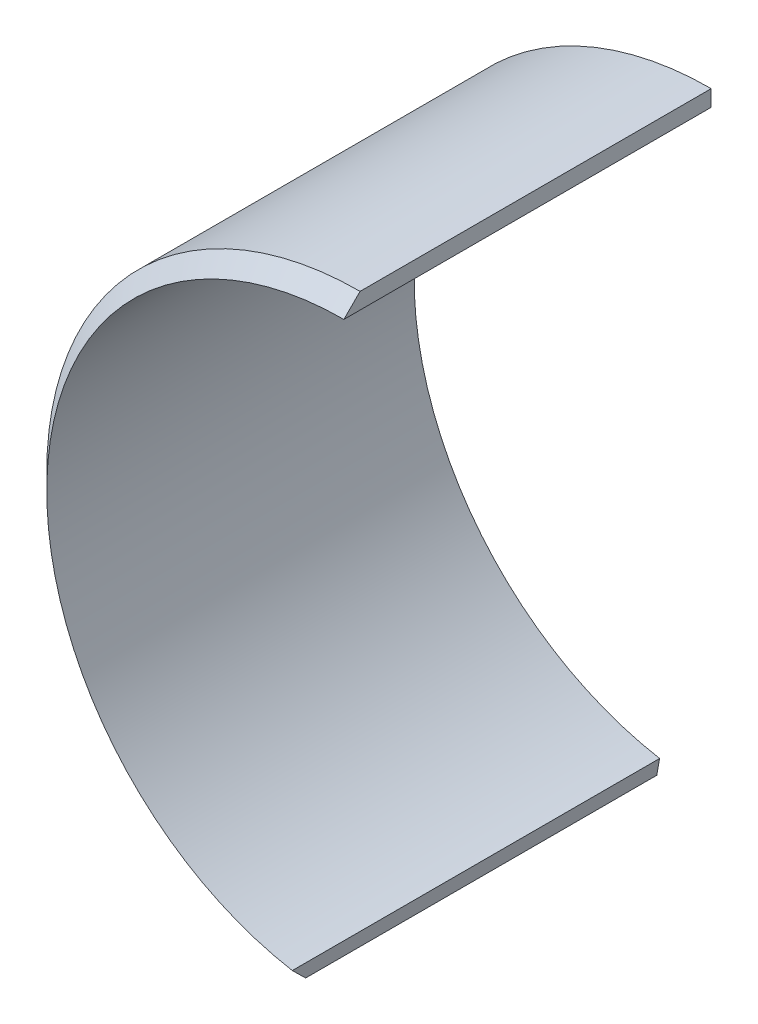
ISO-10303-21;
HEADER;
FILE_DESCRIPTION(('STEP AP214'),'2;1');
FILE_NAME('part.step','',(''),(''),'','','');
FILE_SCHEMA(('AUTOMOTIVE_DESIGN { 1 0 10303 214 1 1 1 1 }'));
ENDSEC;
DATA;
#1=APPLICATION_CONTEXT('core data for automotive mechanical design processes');
#2=APPLICATION_PROTOCOL_DEFINITION('international standard','automotive_design',2000,#1);
#3=PRODUCT_CONTEXT('',#1,'mechanical');
#4=PRODUCT('Part','Part','',(#3));
#5=PRODUCT_RELATED_PRODUCT_CATEGORY('part','',(#4));
#6=PRODUCT_DEFINITION_FORMATION('','',#4);
#7=PRODUCT_DEFINITION_CONTEXT('part definition',#1,'design');
#8=PRODUCT_DEFINITION('design','',#6,#7);
#9=PRODUCT_DEFINITION_SHAPE('','',#8);
#10=(LENGTH_UNIT() NAMED_UNIT(*) SI_UNIT(.MILLI.,.METRE.));
#11=(NAMED_UNIT(*) PLANE_ANGLE_UNIT() SI_UNIT($,.RADIAN.));
#12=(NAMED_UNIT(*) SI_UNIT($,.STERADIAN.) SOLID_ANGLE_UNIT());
#13=UNCERTAINTY_MEASURE_WITH_UNIT(LENGTH_MEASURE(1.E-05),#10,'distance_accuracy_value','');
#14=(GEOMETRIC_REPRESENTATION_CONTEXT(3) GLOBAL_UNCERTAINTY_ASSIGNED_CONTEXT((#13)) GLOBAL_UNIT_ASSIGNED_CONTEXT((#10,
#11,#12)) REPRESENTATION_CONTEXT('',''));
#15=CARTESIAN_POINT('',(0.,0.,0.));
#16=DIRECTION('',(0.,0.,1.));
#17=DIRECTION('',(1.,0.,0.));
#18=AXIS2_PLACEMENT_3D('',#15,#16,#17);
#19=CARTESIAN_POINT('',(0.,0.,19.05));
#20=DIRECTION('',(0.,0.,-1.));
#21=DIRECTION('',(-1.,0.,0.));
#22=AXIS2_PLACEMENT_3D('',#19,#20,#21);
#23=CYLINDRICAL_SURFACE('',#22,13.97);
#24=DIRECTION('',(0.,0.,-1.));
#25=VECTOR('',#24,1.);
#26=CARTESIAN_POINT('',(0.,13.97,19.05));
#27=LINE('',#26,#25);
#28=CARTESIAN_POINT('',(0.,13.97,17.272));
#29=VERTEX_POINT('',#28);
#30=CARTESIAN_POINT('',(0.,13.97,0.));
#31=VERTEX_POINT('',#30);
#32=EDGE_CURVE('E74',#29,#31,#27,.T.);
#33=ORIENTED_EDGE('',*,*,#32,.F.);
#34=CARTESIAN_POINT('',(0.,0.,17.272));
#35=DIRECTION('',(0.,0.,-1.));
#36=DIRECTION('',(-1.,0.,0.));
#37=AXIS2_PLACEMENT_3D('',#34,#35,#36);
#38=CIRCLE('',#37,13.97);
#39=CARTESIAN_POINT('',(-2.42586504200703,-13.7577643095805,17.272));
#40=VERTEX_POINT('',#39);
#41=EDGE_CURVE('E82',#29,#40,#38,.F.);
#42=ORIENTED_EDGE('',*,*,#41,.T.);
#43=DIRECTION('',(0.,0.,-1.));
#44=VECTOR('',#43,1.);
#45=CARTESIAN_POINT('',(-2.42586504200703,-13.7577643095805,19.05));
#46=LINE('',#45,#44);
#47=CARTESIAN_POINT('',(-2.42586504200703,-13.7577643095805,0.));
#48=VERTEX_POINT('',#47);
#49=EDGE_CURVE('E93',#40,#48,#46,.T.);
#50=ORIENTED_EDGE('',*,*,#49,.T.);
#51=CARTESIAN_POINT('',(0.,0.,0.));
#52=DIRECTION('',(0.,0.,-1.));
#53=DIRECTION('',(1.,0.,0.));
#54=AXIS2_PLACEMENT_3D('',#51,#52,#53);
#55=CIRCLE('',#54,13.97);
#56=EDGE_CURVE('E89',#48,#31,#55,.T.);
#57=ORIENTED_EDGE('',*,*,#56,.T.);
#58=EDGE_LOOP('',(#33,#42,#50,#57));
#59=FACE_BOUND('',#58,.T.);
#60=ADVANCED_FACE('F33',(#59),#23,.F.);
#61=CARTESIAN_POINT('',(0.,13.97,19.05));
#62=DIRECTION('',(-1.,0.,0.));
#63=DIRECTION('',(0.,0.,1.));
#64=AXIS2_PLACEMENT_3D('',#61,#62,#63);
#65=PLANE('',#64);
#66=DIRECTION('',(0.,0.,-1.));
#67=VECTOR('',#66,1.);
#68=CARTESIAN_POINT('',(0.,14.732,19.05));
#69=LINE('',#68,#67);
#70=CARTESIAN_POINT('',(0.,14.732,16.51));
#71=VERTEX_POINT('',#70);
#72=CARTESIAN_POINT('',(0.,14.732,0.));
#73=VERTEX_POINT('',#72);
#74=EDGE_CURVE('E83',#71,#73,#69,.T.);
#75=ORIENTED_EDGE('',*,*,#74,.F.);
#76=DIRECTION('',(0.,0.707106781186551,-0.707106781186544));
#77=VECTOR('',#76,1.);
#78=CARTESIAN_POINT('',(0.,0.,31.2419999999998));
#79=LINE('',#78,#77);
#80=EDGE_CURVE('E11',#71,#29,#79,.F.);
#81=ORIENTED_EDGE('',*,*,#80,.T.);
#82=ORIENTED_EDGE('',*,*,#32,.T.);
#83=DIRECTION('',(0.,1.,0.));
#84=VECTOR('',#83,1.);
#85=CARTESIAN_POINT('',(0.,13.97,0.));
#86=LINE('',#85,#84);
#87=EDGE_CURVE('E78',#31,#73,#86,.T.);
#88=ORIENTED_EDGE('',*,*,#87,.T.);
#89=EDGE_LOOP('',(#75,#81,#82,#88));
#90=FACE_BOUND('',#89,.T.);
#91=ADVANCED_FACE('F77',(#90),#65,.F.);
#92=CARTESIAN_POINT('',(0.,0.,19.05));
#93=DIRECTION('',(0.,0.,-1.));
#94=DIRECTION('',(-1.,0.,0.));
#95=AXIS2_PLACEMENT_3D('',#92,#93,#94);
#96=CYLINDRICAL_SURFACE('',#95,14.732);
#97=DIRECTION('',(0.,0.,-1.));
#98=VECTOR('',#97,1.);
#99=CARTESIAN_POINT('',(-2.55818495338923,-14.5081878173758,19.05));
#100=LINE('',#99,#98);
#101=CARTESIAN_POINT('',(-2.55818495338923,-14.5081878173758,16.51));
#102=VERTEX_POINT('',#101);
#103=CARTESIAN_POINT('',(-2.55818495338923,-14.5081878173758,0.));
#104=VERTEX_POINT('',#103);
#105=EDGE_CURVE('E101',#102,#104,#100,.T.);
#106=ORIENTED_EDGE('',*,*,#105,.F.);
#107=CARTESIAN_POINT('',(0.,0.,16.51));
#108=DIRECTION('',(0.,0.,1.));
#109=DIRECTION('',(1.,0.,0.));
#110=AXIS2_PLACEMENT_3D('',#107,#108,#109);
#111=CIRCLE('',#110,14.732);
#112=EDGE_CURVE('E41',#102,#71,#111,.F.);
#113=ORIENTED_EDGE('',*,*,#112,.T.);
#114=ORIENTED_EDGE('',*,*,#74,.T.);
#115=CARTESIAN_POINT('',(0.,0.,0.));
#116=DIRECTION('',(0.,0.,1.));
#117=DIRECTION('',(1.,0.,0.));
#118=AXIS2_PLACEMENT_3D('',#115,#116,#117);
#119=CIRCLE('',#118,14.732);
#120=EDGE_CURVE('E91',#73,#104,#119,.T.);
#121=ORIENTED_EDGE('',*,*,#120,.T.);
#122=EDGE_LOOP('',(#106,#113,#114,#121));
#123=FACE_BOUND('',#122,.T.);
#124=ADVANCED_FACE('F106',(#123),#96,.T.);
#125=CARTESIAN_POINT('',(-2.55818495338923,-14.5081878173758,19.05));
#126=DIRECTION('',(-0.984807753012208,0.173648177666931,0.));
#127=DIRECTION('',(-0.173648177666931,-0.984807753012208,0.));
#128=AXIS2_PLACEMENT_3D('',#125,#126,#127);
#129=PLANE('',#128);
#130=ORIENTED_EDGE('',*,*,#49,.F.);
#131=DIRECTION('',(0.122787803968974,0.696364240320023,0.707106781186544));
#132=VECTOR('',#131,1.);
#133=CARTESIAN_POINT('',(0.,0.,31.2419999999998));
#134=LINE('',#133,#132);
#135=EDGE_CURVE('E54',#40,#102,#134,.F.);
#136=ORIENTED_EDGE('',*,*,#135,.T.);
#137=ORIENTED_EDGE('',*,*,#105,.T.);
#138=DIRECTION('',(0.173648177666931,0.984807753012208,0.));
#139=VECTOR('',#138,1.);
#140=CARTESIAN_POINT('',(-2.55818495338923,-14.5081878173758,0.));
#141=LINE('',#140,#139);
#142=EDGE_CURVE('E98',#104,#48,#141,.T.);
#143=ORIENTED_EDGE('',*,*,#142,.T.);
#144=EDGE_LOOP('',(#130,#136,#137,#143));
#145=FACE_BOUND('',#144,.T.);
#146=ADVANCED_FACE('F107',(#145),#129,.F.);
#147=CARTESIAN_POINT('',(0.,0.,0.));
#148=DIRECTION('',(0.,0.,1.));
#149=DIRECTION('',(1.,0.,0.));
#150=AXIS2_PLACEMENT_3D('',#147,#148,#149);
#151=PLANE('',#150);
#152=ORIENTED_EDGE('',*,*,#56,.F.);
#153=ORIENTED_EDGE('',*,*,#142,.F.);
#154=ORIENTED_EDGE('',*,*,#120,.F.);
#155=ORIENTED_EDGE('',*,*,#87,.F.);
#156=EDGE_LOOP('',(#152,#153,#154,#155));
#157=FACE_BOUND('',#156,.T.);
#158=ADVANCED_FACE('F87',(#157),#151,.F.);
#159=CARTESIAN_POINT('',(0.,0.,19.05));
#160=DIRECTION('',(0.,0.,-1.));
#161=DIRECTION('',(-1.,0.,0.));
#162=AXIS2_PLACEMENT_3D('',#159,#160,#161);
#163=CONICAL_SURFACE('',#162,12.192,0.785398163397454);
#164=ORIENTED_EDGE('',*,*,#80,.F.);
#165=ORIENTED_EDGE('',*,*,#112,.F.);
#166=ORIENTED_EDGE('',*,*,#135,.F.);
#167=ORIENTED_EDGE('',*,*,#41,.F.);
#168=EDGE_LOOP('',(#164,#165,#166,#167));
#169=FACE_BOUND('',#168,.T.);
#170=ADVANCED_FACE('F35',(#169),#163,.T.);
#171=CLOSED_SHELL('',(#60,#91,#124,#146,#158,#170));
#172=MANIFOLD_SOLID_BREP('B2',#171);
#173=ADVANCED_BREP_SHAPE_REPRESENTATION('',(#18,#172),#14);
#174=SHAPE_DEFINITION_REPRESENTATION(#9,#173);
ENDSEC;
END-ISO-10303-21;
